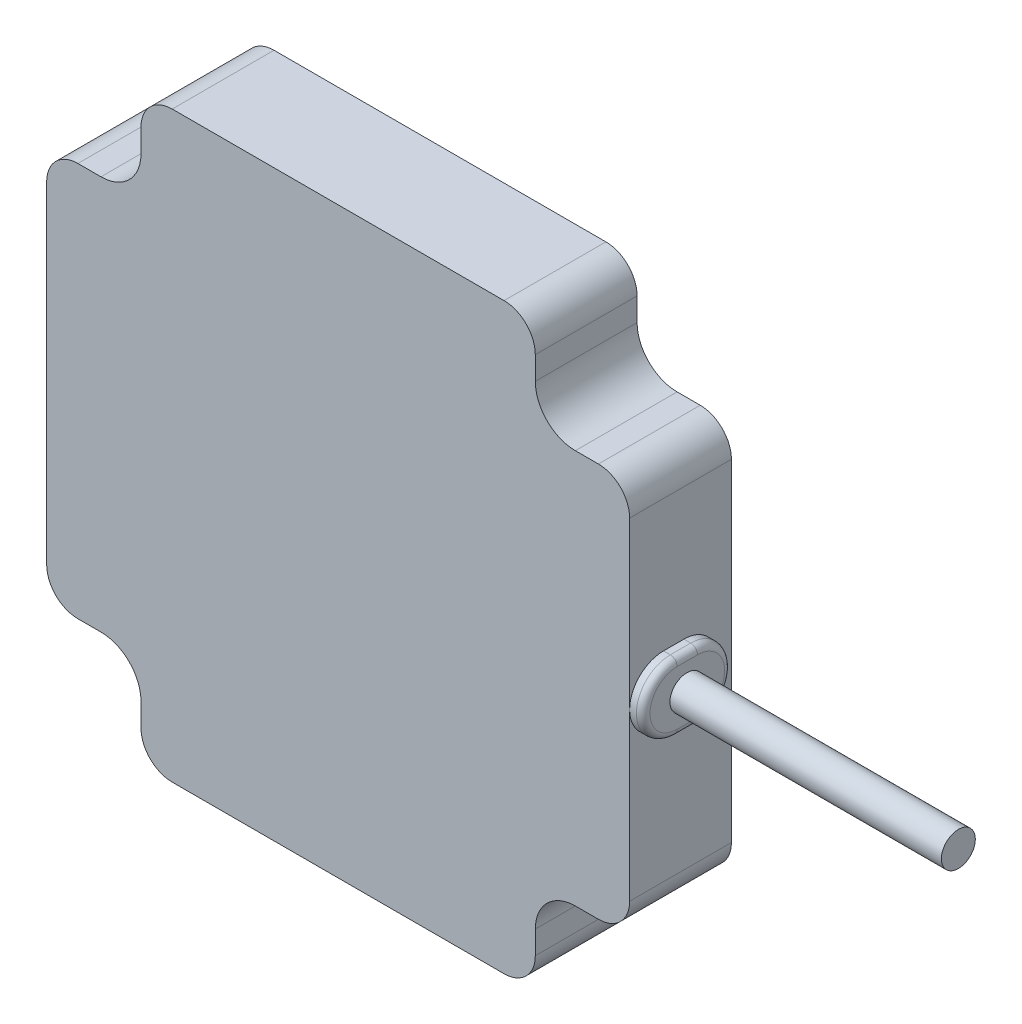
ISO-10303-21;
HEADER;
FILE_DESCRIPTION(('STEP AP214'),'2;1');
FILE_NAME('part.step','',(''),(''),'','','');
FILE_SCHEMA(('AUTOMOTIVE_DESIGN { 1 0 10303 214 1 1 1 1 }'));
ENDSEC;
DATA;
#1=APPLICATION_CONTEXT('core data for automotive mechanical design processes');
#2=APPLICATION_PROTOCOL_DEFINITION('international standard','automotive_design',2000,#1);
#3=PRODUCT_CONTEXT('',#1,'mechanical');
#4=PRODUCT('Part','Part','',(#3));
#5=PRODUCT_RELATED_PRODUCT_CATEGORY('part','',(#4));
#6=PRODUCT_DEFINITION_FORMATION('','',#4);
#7=PRODUCT_DEFINITION_CONTEXT('part definition',#1,'design');
#8=PRODUCT_DEFINITION('design','',#6,#7);
#9=PRODUCT_DEFINITION_SHAPE('','',#8);
#10=(LENGTH_UNIT() NAMED_UNIT(*) SI_UNIT(.MILLI.,.METRE.));
#11=(NAMED_UNIT(*) PLANE_ANGLE_UNIT() SI_UNIT($,.RADIAN.));
#12=(NAMED_UNIT(*) SI_UNIT($,.STERADIAN.) SOLID_ANGLE_UNIT());
#13=UNCERTAINTY_MEASURE_WITH_UNIT(LENGTH_MEASURE(1.E-05),#10,'distance_accuracy_value','');
#14=(GEOMETRIC_REPRESENTATION_CONTEXT(3) GLOBAL_UNCERTAINTY_ASSIGNED_CONTEXT((#13)) GLOBAL_UNIT_ASSIGNED_CONTEXT((#10,
#11,#12)) REPRESENTATION_CONTEXT('',''));
#15=CARTESIAN_POINT('',(0.,0.,0.));
#16=DIRECTION('',(0.,0.,1.));
#17=DIRECTION('',(1.,0.,0.));
#18=AXIS2_PLACEMENT_3D('',#15,#16,#17);
#19=CARTESIAN_POINT('',(-34.9499999999993,-34.9499999999993,0.));
#20=DIRECTION('',(0.,0.,1.));
#21=DIRECTION('',(1.,0.,0.));
#22=AXIS2_PLACEMENT_3D('',#19,#20,#21);
#23=PLANE('',#22);
#24=CARTESIAN_POINT('',(-34.9499999999993,-34.9499999999993,0.));
#25=DIRECTION('',(0.,0.,-1.));
#26=DIRECTION('',(1.,0.,0.));
#27=AXIS2_PLACEMENT_3D('',#24,#25,#26);
#28=CIRCLE('',#27,5.89999999999956);
#29=CARTESIAN_POINT('',(-34.9499999999993,-29.05,0.));
#30=VERTEX_POINT('',#29);
#31=CARTESIAN_POINT('',(-29.05,-34.95,0.));
#32=VERTEX_POINT('',#31);
#33=EDGE_CURVE('P0_E435',#30,#32,#28,.T.);
#34=ORIENTED_EDGE('',*,*,#33,.F.);
#35=DIRECTION('',(1.,0.,0.));
#36=VECTOR('',#35,1.);
#37=CARTESIAN_POINT('',(-34.9499999999993,-29.05,0.));
#38=LINE('',#37,#36);
#39=CARTESIAN_POINT('',(-38.3499999999995,-29.05,0.));
#40=VERTEX_POINT('',#39);
#41=EDGE_CURVE('P0_E26',#40,#30,#38,.T.);
#42=ORIENTED_EDGE('',*,*,#41,.F.);
#43=CARTESIAN_POINT('',(-38.3499999999995,-24.45,0.));
#44=DIRECTION('',(0.,0.,1.));
#45=DIRECTION('',(1.,0.,0.));
#46=AXIS2_PLACEMENT_3D('',#43,#44,#45);
#47=CIRCLE('',#46,4.6);
#48=CARTESIAN_POINT('',(-42.9499999999994,-24.45,0.));
#49=VERTEX_POINT('',#48);
#50=EDGE_CURVE('P0_E334',#49,#40,#47,.T.);
#51=ORIENTED_EDGE('',*,*,#50,.F.);
#52=DIRECTION('',(0.,-1.,0.));
#53=VECTOR('',#52,1.);
#54=CARTESIAN_POINT('',(-42.9499999999994,0.,0.));
#55=LINE('',#54,#53);
#56=CARTESIAN_POINT('',(-42.9499999999995,24.45,0.));
#57=VERTEX_POINT('',#56);
#58=EDGE_CURVE('P0_E414',#57,#49,#55,.T.);
#59=ORIENTED_EDGE('',*,*,#58,.F.);
#60=CARTESIAN_POINT('',(-38.3499999999995,24.45,0.));
#61=DIRECTION('',(0.,0.,1.));
#62=DIRECTION('',(1.,0.,0.));
#63=AXIS2_PLACEMENT_3D('',#60,#61,#62);
#64=CIRCLE('',#63,4.6);
#65=CARTESIAN_POINT('',(-38.3499999999995,29.05,0.));
#66=VERTEX_POINT('',#65);
#67=EDGE_CURVE('P0_E405',#66,#57,#64,.T.);
#68=ORIENTED_EDGE('',*,*,#67,.F.);
#69=DIRECTION('',(-1.,0.,0.));
#70=VECTOR('',#69,1.);
#71=CARTESIAN_POINT('',(-34.9499999999993,29.05,0.));
#72=LINE('',#71,#70);
#73=CARTESIAN_POINT('',(-34.9499999999993,29.0500000000004,0.));
#74=VERTEX_POINT('',#73);
#75=EDGE_CURVE('P0_E328',#74,#66,#72,.T.);
#76=ORIENTED_EDGE('',*,*,#75,.F.);
#77=CARTESIAN_POINT('',(-34.9499999999993,34.95,0.));
#78=DIRECTION('',(0.,0.,-1.));
#79=DIRECTION('',(1.,0.,0.));
#80=AXIS2_PLACEMENT_3D('',#77,#78,#79);
#81=CIRCLE('',#80,5.89999999999977);
#82=CARTESIAN_POINT('',(-29.05,34.95,0.));
#83=VERTEX_POINT('',#82);
#84=EDGE_CURVE('P0_E401',#83,#74,#81,.T.);
#85=ORIENTED_EDGE('',*,*,#84,.F.);
#86=DIRECTION('',(0.,-1.,0.));
#87=VECTOR('',#86,1.);
#88=CARTESIAN_POINT('',(-29.05,34.95,0.));
#89=LINE('',#88,#87);
#90=CARTESIAN_POINT('',(-29.05,38.35,0.));
#91=VERTEX_POINT('',#90);
#92=EDGE_CURVE('P0_E374',#91,#83,#89,.T.);
#93=ORIENTED_EDGE('',*,*,#92,.F.);
#94=CARTESIAN_POINT('',(-24.45,38.35,0.));
#95=DIRECTION('',(0.,0.,1.));
#96=DIRECTION('',(1.,0.,0.));
#97=AXIS2_PLACEMENT_3D('',#94,#95,#96);
#98=CIRCLE('',#97,4.6);
#99=CARTESIAN_POINT('',(-24.4499999999985,42.95,0.));
#100=VERTEX_POINT('',#99);
#101=EDGE_CURVE('P0_E233',#100,#91,#98,.T.);
#102=ORIENTED_EDGE('',*,*,#101,.F.);
#103=DIRECTION('',(-1.,0.,0.));
#104=VECTOR('',#103,1.);
#105=CARTESIAN_POINT('',(1.3739009929736E-12,42.95,0.));
#106=LINE('',#105,#104);
#107=CARTESIAN_POINT('',(24.4500000000012,42.95,0.));
#108=VERTEX_POINT('',#107);
#109=EDGE_CURVE('P0_E226',#108,#100,#106,.T.);
#110=ORIENTED_EDGE('',*,*,#109,.F.);
#111=CARTESIAN_POINT('',(24.4500000000012,38.35,0.));
#112=DIRECTION('',(0.,0.,1.));
#113=DIRECTION('',(1.,0.,0.));
#114=AXIS2_PLACEMENT_3D('',#111,#112,#113);
#115=CIRCLE('',#114,4.59999999999994);
#116=CARTESIAN_POINT('',(29.0500000000011,38.35,0.));
#117=VERTEX_POINT('',#116);
#118=EDGE_CURVE('P0_E230',#117,#108,#115,.T.);
#119=ORIENTED_EDGE('',*,*,#118,.F.);
#120=DIRECTION('',(0.,1.,0.));
#121=VECTOR('',#120,1.);
#122=CARTESIAN_POINT('',(29.0500000000011,34.95,0.));
#123=LINE('',#122,#121);
#124=CARTESIAN_POINT('',(29.0500000000011,34.95,0.));
#125=VERTEX_POINT('',#124);
#126=EDGE_CURVE('P0_E369',#125,#117,#123,.T.);
#127=ORIENTED_EDGE('',*,*,#126,.F.);
#128=CARTESIAN_POINT('',(34.9500000000016,34.9500000000005,0.));
#129=DIRECTION('',(0.,0.,-1.));
#130=DIRECTION('',(1.,0.,0.));
#131=AXIS2_PLACEMENT_3D('',#128,#129,#130);
#132=CIRCLE('',#131,5.90000000000043);
#133=CARTESIAN_POINT('',(34.9500000000016,29.05,0.));
#134=VERTEX_POINT('',#133);
#135=EDGE_CURVE('P0_E301',#134,#125,#132,.T.);
#136=ORIENTED_EDGE('',*,*,#135,.F.);
#137=DIRECTION('',(-1.,0.,0.));
#138=VECTOR('',#137,1.);
#139=CARTESIAN_POINT('',(34.9500000000016,29.05,0.));
#140=LINE('',#139,#138);
#141=CARTESIAN_POINT('',(38.3500000000016,29.05,0.));
#142=VERTEX_POINT('',#141);
#143=EDGE_CURVE('P0_E349',#142,#134,#140,.T.);
#144=ORIENTED_EDGE('',*,*,#143,.F.);
#145=CARTESIAN_POINT('',(38.3500000000014,24.45,0.));
#146=DIRECTION('',(0.,0.,1.));
#147=DIRECTION('',(1.,0.,0.));
#148=AXIS2_PLACEMENT_3D('',#145,#146,#147);
#149=CIRCLE('',#148,4.59999999999994);
#150=CARTESIAN_POINT('',(42.9500000000013,24.4499999999992,0.));
#151=VERTEX_POINT('',#150);
#152=EDGE_CURVE('P0_E323',#151,#142,#149,.T.);
#153=ORIENTED_EDGE('',*,*,#152,.F.);
#154=DIRECTION('',(0.,1.,0.));
#155=VECTOR('',#154,1.);
#156=CARTESIAN_POINT('',(42.9500000000013,-1.11022302462521E-12,0.));
#157=LINE('',#156,#155);
#158=CARTESIAN_POINT('',(42.9500000000013,-24.4500000000008,0.));
#159=VERTEX_POINT('',#158);
#160=EDGE_CURVE('P0_E311',#159,#151,#157,.T.);
#161=ORIENTED_EDGE('',*,*,#160,.F.);
#162=CARTESIAN_POINT('',(38.3500000000013,-24.45,0.));
#163=DIRECTION('',(0.,0.,1.));
#164=DIRECTION('',(1.,0.,0.));
#165=AXIS2_PLACEMENT_3D('',#162,#163,#164);
#166=CIRCLE('',#165,4.6);
#167=CARTESIAN_POINT('',(38.35,-29.05,0.));
#168=VERTEX_POINT('',#167);
#169=EDGE_CURVE('P0_E296',#168,#159,#166,.T.);
#170=ORIENTED_EDGE('',*,*,#169,.F.);
#171=DIRECTION('',(1.,0.,0.));
#172=VECTOR('',#171,1.);
#173=CARTESIAN_POINT('',(34.9500000000013,-29.05,0.));
#174=LINE('',#173,#172);
#175=CARTESIAN_POINT('',(34.9500000000013,-29.05,0.));
#176=VERTEX_POINT('',#175);
#177=EDGE_CURVE('P0_E284',#176,#168,#174,.T.);
#178=ORIENTED_EDGE('',*,*,#177,.F.);
#179=CARTESIAN_POINT('',(34.9499999999993,-34.9499999999996,0.));
#180=DIRECTION('',(0.,0.,-1.));
#181=DIRECTION('',(1.,0.,0.));
#182=AXIS2_PLACEMENT_3D('',#179,#180,#181);
#183=CIRCLE('',#182,5.89999999999966);
#184=CARTESIAN_POINT('',(29.05,-34.9499999999996,0.));
#185=VERTEX_POINT('',#184);
#186=EDGE_CURVE('P0_E275',#185,#176,#183,.T.);
#187=ORIENTED_EDGE('',*,*,#186,.F.);
#188=DIRECTION('',(0.,1.,0.));
#189=VECTOR('',#188,1.);
#190=CARTESIAN_POINT('',(29.05,-34.9499999999996,0.));
#191=LINE('',#190,#189);
#192=CARTESIAN_POINT('',(29.05,-38.35,0.));
#193=VERTEX_POINT('',#192);
#194=EDGE_CURVE('P0_E266',#193,#185,#191,.T.);
#195=ORIENTED_EDGE('',*,*,#194,.F.);
#196=CARTESIAN_POINT('',(24.45,-38.35,0.));
#197=DIRECTION('',(0.,0.,1.));
#198=DIRECTION('',(1.,0.,0.));
#199=AXIS2_PLACEMENT_3D('',#196,#197,#198);
#200=CIRCLE('',#199,4.6);
#201=CARTESIAN_POINT('',(24.45,-42.95,0.));
#202=VERTEX_POINT('',#201);
#203=EDGE_CURVE('P0_E472',#202,#193,#200,.T.);
#204=ORIENTED_EDGE('',*,*,#203,.F.);
#205=DIRECTION('',(1.,0.,0.));
#206=VECTOR('',#205,1.);
#207=CARTESIAN_POINT('',(0.,-42.95,0.));
#208=LINE('',#207,#206);
#209=CARTESIAN_POINT('',(-24.45,-42.95,0.));
#210=VERTEX_POINT('',#209);
#211=EDGE_CURVE('P0_E488',#210,#202,#208,.T.);
#212=ORIENTED_EDGE('',*,*,#211,.F.);
#213=CARTESIAN_POINT('',(-24.45,-38.35,0.));
#214=DIRECTION('',(0.,0.,1.));
#215=DIRECTION('',(1.,0.,0.));
#216=AXIS2_PLACEMENT_3D('',#213,#214,#215);
#217=CIRCLE('',#216,4.59999999999994);
#218=CARTESIAN_POINT('',(-29.05,-38.35,0.));
#219=VERTEX_POINT('',#218);
#220=EDGE_CURVE('P0_E480',#219,#210,#217,.T.);
#221=ORIENTED_EDGE('',*,*,#220,.F.);
#222=DIRECTION('',(0.,-1.,0.));
#223=VECTOR('',#222,1.);
#224=CARTESIAN_POINT('',(-29.05,-34.95,0.));
#225=LINE('',#224,#223);
#226=EDGE_CURVE('P0_E439',#32,#219,#225,.T.);
#227=ORIENTED_EDGE('',*,*,#226,.F.);
#228=EDGE_LOOP('',(#34,#42,#51,#59,#68,#76,#85,#93,#102,#110,#119,#127,#136,#144,#153,#161,#170,
#178,#187,#195,#204,#212,#221,#227));
#229=FACE_BOUND('',#228,.T.);
#230=ADVANCED_FACE('P0_F17',(#229),#23,.F.);
#231=CARTESIAN_POINT('',(-34.9499999999993,-34.9499999999993,15.));
#232=DIRECTION('',(0.,0.,1.));
#233=DIRECTION('',(1.,0.,0.));
#234=AXIS2_PLACEMENT_3D('',#231,#232,#233);
#235=PLANE('',#234);
#236=CARTESIAN_POINT('',(-34.9499999999993,-34.9499999999993,15.));
#237=DIRECTION('',(0.,0.,-1.));
#238=DIRECTION('',(1.,0.,0.));
#239=AXIS2_PLACEMENT_3D('',#236,#237,#238);
#240=CIRCLE('',#239,5.89999999999956);
#241=CARTESIAN_POINT('',(-34.9499999999993,-29.05,15.));
#242=VERTEX_POINT('',#241);
#243=CARTESIAN_POINT('',(-29.05,-34.95,15.));
#244=VERTEX_POINT('',#243);
#245=EDGE_CURVE('P0_E437',#242,#244,#240,.T.);
#246=ORIENTED_EDGE('',*,*,#245,.T.);
#247=DIRECTION('',(0.,-1.,0.));
#248=VECTOR('',#247,1.);
#249=CARTESIAN_POINT('',(-29.05,-34.95,15.));
#250=LINE('',#249,#248);
#251=CARTESIAN_POINT('',(-29.05,-38.35,15.));
#252=VERTEX_POINT('',#251);
#253=EDGE_CURVE('P0_E471',#244,#252,#250,.T.);
#254=ORIENTED_EDGE('',*,*,#253,.T.);
#255=CARTESIAN_POINT('',(-24.45,-38.35,15.));
#256=DIRECTION('',(0.,0.,1.));
#257=DIRECTION('',(1.,0.,0.));
#258=AXIS2_PLACEMENT_3D('',#255,#256,#257);
#259=CIRCLE('',#258,4.59999999999994);
#260=CARTESIAN_POINT('',(-24.45,-42.95,15.));
#261=VERTEX_POINT('',#260);
#262=EDGE_CURVE('P0_E454',#252,#261,#259,.T.);
#263=ORIENTED_EDGE('',*,*,#262,.T.);
#264=DIRECTION('',(1.,0.,0.));
#265=VECTOR('',#264,1.);
#266=CARTESIAN_POINT('',(0.,-42.95,15.));
#267=LINE('',#266,#265);
#268=CARTESIAN_POINT('',(24.45,-42.95,15.));
#269=VERTEX_POINT('',#268);
#270=EDGE_CURVE('P0_E476',#261,#269,#267,.T.);
#271=ORIENTED_EDGE('',*,*,#270,.T.);
#272=CARTESIAN_POINT('',(24.45,-38.35,15.));
#273=DIRECTION('',(0.,0.,1.));
#274=DIRECTION('',(1.,0.,0.));
#275=AXIS2_PLACEMENT_3D('',#272,#273,#274);
#276=CIRCLE('',#275,4.6);
#277=CARTESIAN_POINT('',(29.05,-38.35,15.));
#278=VERTEX_POINT('',#277);
#279=EDGE_CURVE('P0_E456',#269,#278,#276,.T.);
#280=ORIENTED_EDGE('',*,*,#279,.T.);
#281=DIRECTION('',(0.,1.,0.));
#282=VECTOR('',#281,1.);
#283=CARTESIAN_POINT('',(29.05,-34.9499999999996,15.));
#284=LINE('',#283,#282);
#285=CARTESIAN_POINT('',(29.05,-34.9499999999996,15.));
#286=VERTEX_POINT('',#285);
#287=EDGE_CURVE('P0_E271',#278,#286,#284,.T.);
#288=ORIENTED_EDGE('',*,*,#287,.T.);
#289=CARTESIAN_POINT('',(34.9499999999993,-34.9499999999996,15.));
#290=DIRECTION('',(0.,0.,-1.));
#291=DIRECTION('',(1.,0.,0.));
#292=AXIS2_PLACEMENT_3D('',#289,#290,#291);
#293=CIRCLE('',#292,5.89999999999966);
#294=CARTESIAN_POINT('',(34.9500000000013,-29.05,15.));
#295=VERTEX_POINT('',#294);
#296=EDGE_CURVE('P0_E280',#286,#295,#293,.T.);
#297=ORIENTED_EDGE('',*,*,#296,.T.);
#298=DIRECTION('',(1.,0.,0.));
#299=VECTOR('',#298,1.);
#300=CARTESIAN_POINT('',(34.9500000000013,-29.05,15.));
#301=LINE('',#300,#299);
#302=CARTESIAN_POINT('',(38.35,-29.05,15.));
#303=VERTEX_POINT('',#302);
#304=EDGE_CURVE('P0_E292',#295,#303,#301,.T.);
#305=ORIENTED_EDGE('',*,*,#304,.T.);
#306=CARTESIAN_POINT('',(38.3500000000013,-24.45,15.));
#307=DIRECTION('',(0.,0.,1.));
#308=DIRECTION('',(1.,0.,0.));
#309=AXIS2_PLACEMENT_3D('',#306,#307,#308);
#310=CIRCLE('',#309,4.6);
#311=CARTESIAN_POINT('',(42.9500000000013,-24.4500000000008,15.));
#312=VERTEX_POINT('',#311);
#313=EDGE_CURVE('P0_E310',#303,#312,#310,.T.);
#314=ORIENTED_EDGE('',*,*,#313,.T.);
#315=DIRECTION('',(0.,1.,0.));
#316=VECTOR('',#315,1.);
#317=CARTESIAN_POINT('',(42.9500000000013,-1.11022302462521E-12,15.));
#318=LINE('',#317,#316);
#319=CARTESIAN_POINT('',(42.9500000000013,24.4499999999992,15.));
#320=VERTEX_POINT('',#319);
#321=EDGE_CURVE('P0_E319',#312,#320,#318,.T.);
#322=ORIENTED_EDGE('',*,*,#321,.T.);
#323=CARTESIAN_POINT('',(38.3500000000014,24.45,15.));
#324=DIRECTION('',(0.,0.,1.));
#325=DIRECTION('',(1.,0.,0.));
#326=AXIS2_PLACEMENT_3D('',#323,#324,#325);
#327=CIRCLE('',#326,4.59999999999994);
#328=CARTESIAN_POINT('',(38.3500000000016,29.05,15.));
#329=VERTEX_POINT('',#328);
#330=EDGE_CURVE('P0_E343',#320,#329,#327,.T.);
#331=ORIENTED_EDGE('',*,*,#330,.T.);
#332=DIRECTION('',(-1.,0.,0.));
#333=VECTOR('',#332,1.);
#334=CARTESIAN_POINT('',(34.9500000000016,29.05,15.));
#335=LINE('',#334,#333);
#336=CARTESIAN_POINT('',(34.9500000000016,29.05,15.));
#337=VERTEX_POINT('',#336);
#338=EDGE_CURVE('P0_E297',#329,#337,#335,.T.);
#339=ORIENTED_EDGE('',*,*,#338,.T.);
#340=CARTESIAN_POINT('',(34.9500000000016,34.9500000000005,15.));
#341=DIRECTION('',(0.,0.,-1.));
#342=DIRECTION('',(1.,0.,0.));
#343=AXIS2_PLACEMENT_3D('',#340,#341,#342);
#344=CIRCLE('',#343,5.90000000000043);
#345=CARTESIAN_POINT('',(29.0500000000011,34.95,15.));
#346=VERTEX_POINT('',#345);
#347=EDGE_CURVE('P0_E360',#337,#346,#344,.T.);
#348=ORIENTED_EDGE('',*,*,#347,.T.);
#349=DIRECTION('',(0.,1.,0.));
#350=VECTOR('',#349,1.);
#351=CARTESIAN_POINT('',(29.0500000000011,34.95,15.));
#352=LINE('',#351,#350);
#353=CARTESIAN_POINT('',(29.0500000000011,38.35,15.));
#354=VERTEX_POINT('',#353);
#355=EDGE_CURVE('P0_E255',#346,#354,#352,.T.);
#356=ORIENTED_EDGE('',*,*,#355,.T.);
#357=CARTESIAN_POINT('',(24.4500000000012,38.35,15.));
#358=DIRECTION('',(0.,0.,1.));
#359=DIRECTION('',(1.,0.,0.));
#360=AXIS2_PLACEMENT_3D('',#357,#358,#359);
#361=CIRCLE('',#360,4.59999999999994);
#362=CARTESIAN_POINT('',(24.4500000000012,42.95,15.));
#363=VERTEX_POINT('',#362);
#364=EDGE_CURVE('P0_E239',#354,#363,#361,.T.);
#365=ORIENTED_EDGE('',*,*,#364,.T.);
#366=DIRECTION('',(-1.,0.,0.));
#367=VECTOR('',#366,1.);
#368=CARTESIAN_POINT('',(1.3739009929736E-12,42.95,15.));
#369=LINE('',#368,#367);
#370=CARTESIAN_POINT('',(-24.4499999999985,42.95,15.));
#371=VERTEX_POINT('',#370);
#372=EDGE_CURVE('P0_E245',#363,#371,#369,.T.);
#373=ORIENTED_EDGE('',*,*,#372,.T.);
#374=CARTESIAN_POINT('',(-24.45,38.35,15.));
#375=DIRECTION('',(0.,0.,1.));
#376=DIRECTION('',(1.,0.,0.));
#377=AXIS2_PLACEMENT_3D('',#374,#375,#376);
#378=CIRCLE('',#377,4.6);
#379=CARTESIAN_POINT('',(-29.05,38.35,15.));
#380=VERTEX_POINT('',#379);
#381=EDGE_CURVE('P0_E370',#371,#380,#378,.T.);
#382=ORIENTED_EDGE('',*,*,#381,.T.);
#383=DIRECTION('',(0.,-1.,0.));
#384=VECTOR('',#383,1.);
#385=CARTESIAN_POINT('',(-29.05,34.95,15.));
#386=LINE('',#385,#384);
#387=CARTESIAN_POINT('',(-29.05,34.95,15.));
#388=VERTEX_POINT('',#387);
#389=EDGE_CURVE('P0_E397',#380,#388,#386,.T.);
#390=ORIENTED_EDGE('',*,*,#389,.T.);
#391=CARTESIAN_POINT('',(-34.9499999999993,34.95,15.));
#392=DIRECTION('',(0.,0.,-1.));
#393=DIRECTION('',(1.,0.,0.));
#394=AXIS2_PLACEMENT_3D('',#391,#392,#393);
#395=CIRCLE('',#394,5.89999999999977);
#396=CARTESIAN_POINT('',(-34.9499999999993,29.0500000000004,15.));
#397=VERTEX_POINT('',#396);
#398=EDGE_CURVE('P0_E324',#388,#397,#395,.T.);
#399=ORIENTED_EDGE('',*,*,#398,.T.);
#400=DIRECTION('',(-1.,0.,0.));
#401=VECTOR('',#400,1.);
#402=CARTESIAN_POINT('',(-34.9499999999993,29.05,15.));
#403=LINE('',#402,#401);
#404=CARTESIAN_POINT('',(-38.3499999999995,29.05,15.));
#405=VERTEX_POINT('',#404);
#406=EDGE_CURVE('P0_E365',#397,#405,#403,.T.);
#407=ORIENTED_EDGE('',*,*,#406,.T.);
#408=CARTESIAN_POINT('',(-38.3499999999995,24.45,15.));
#409=DIRECTION('',(0.,0.,1.));
#410=DIRECTION('',(1.,0.,0.));
#411=AXIS2_PLACEMENT_3D('',#408,#409,#410);
#412=CIRCLE('',#411,4.6);
#413=CARTESIAN_POINT('',(-42.9499999999995,24.45,15.));
#414=VERTEX_POINT('',#413);
#415=EDGE_CURVE('P0_E410',#405,#414,#412,.T.);
#416=ORIENTED_EDGE('',*,*,#415,.T.);
#417=DIRECTION('',(0.,-1.,0.));
#418=VECTOR('',#417,1.);
#419=CARTESIAN_POINT('',(-42.9499999999994,0.,15.));
#420=LINE('',#419,#418);
#421=CARTESIAN_POINT('',(-42.9499999999994,-24.45,15.));
#422=VERTEX_POINT('',#421);
#423=EDGE_CURVE('P0_E339',#414,#422,#420,.T.);
#424=ORIENTED_EDGE('',*,*,#423,.T.);
#425=CARTESIAN_POINT('',(-38.3499999999995,-24.45,15.));
#426=DIRECTION('',(0.,0.,1.));
#427=DIRECTION('',(1.,0.,0.));
#428=AXIS2_PLACEMENT_3D('',#425,#426,#427);
#429=CIRCLE('',#428,4.6);
#430=CARTESIAN_POINT('',(-38.3499999999995,-29.05,15.));
#431=VERTEX_POINT('',#430);
#432=EDGE_CURVE('P0_E380',#422,#431,#429,.T.);
#433=ORIENTED_EDGE('',*,*,#432,.T.);
#434=DIRECTION('',(1.,0.,0.));
#435=VECTOR('',#434,1.);
#436=CARTESIAN_POINT('',(-34.9499999999993,-29.05,15.));
#437=LINE('',#436,#435);
#438=EDGE_CURVE('P0_E11',#431,#242,#437,.T.);
#439=ORIENTED_EDGE('',*,*,#438,.T.);
#440=EDGE_LOOP('',(#246,#254,#263,#271,#280,#288,#297,#305,#314,#322,#331,#339,#348,#356,#365,
#373,#382,#390,#399,#407,#416,#424,#433,#439));
#441=FACE_BOUND('',#440,.T.);
#442=ADVANCED_FACE('P0_F531',(#441),#235,.T.);
#443=CARTESIAN_POINT('',(-34.9499999999993,-29.05,15.));
#444=DIRECTION('',(0.,1.,0.));
#445=DIRECTION('',(1.,0.,0.));
#446=AXIS2_PLACEMENT_3D('',#443,#444,#445);
#447=PLANE('',#446);
#448=ORIENTED_EDGE('',*,*,#41,.T.);
#449=DIRECTION('',(0.,0.,-1.));
#450=VECTOR('',#449,1.);
#451=CARTESIAN_POINT('',(-34.9499999999993,-29.05,15.));
#452=LINE('',#451,#450);
#453=EDGE_CURVE('P0_E428',#242,#30,#452,.T.);
#454=ORIENTED_EDGE('',*,*,#453,.F.);
#455=ORIENTED_EDGE('',*,*,#438,.F.);
#456=DIRECTION('',(0.,0.,-1.));
#457=VECTOR('',#456,1.);
#458=CARTESIAN_POINT('',(-38.3499999999995,-29.05,15.));
#459=LINE('',#458,#457);
#460=EDGE_CURVE('P0_E338',#431,#40,#459,.T.);
#461=ORIENTED_EDGE('',*,*,#460,.T.);
#462=EDGE_LOOP('',(#448,#454,#455,#461));
#463=FACE_BOUND('',#462,.T.);
#464=ADVANCED_FACE('P0_F427',(#463),#447,.F.);
#465=CARTESIAN_POINT('',(-38.3499999999995,-24.45,15.));
#466=DIRECTION('',(0.,0.,-1.));
#467=DIRECTION('',(-1.,0.,0.));
#468=AXIS2_PLACEMENT_3D('',#465,#466,#467);
#469=CYLINDRICAL_SURFACE('',#468,4.6);
#470=ORIENTED_EDGE('',*,*,#50,.T.);
#471=ORIENTED_EDGE('',*,*,#460,.F.);
#472=ORIENTED_EDGE('',*,*,#432,.F.);
#473=DIRECTION('',(0.,0.,-1.));
#474=VECTOR('',#473,1.);
#475=CARTESIAN_POINT('',(-42.9499999999994,-24.45,15.));
#476=LINE('',#475,#474);
#477=EDGE_CURVE('P0_E417',#422,#49,#476,.T.);
#478=ORIENTED_EDGE('',*,*,#477,.T.);
#479=EDGE_LOOP('',(#470,#471,#472,#478));
#480=FACE_BOUND('',#479,.T.);
#481=ADVANCED_FACE('P0_F873',(#480),#469,.T.);
#482=CARTESIAN_POINT('',(-42.9499999999994,0.,15.));
#483=DIRECTION('',(1.,0.,0.));
#484=DIRECTION('',(0.,1.,0.));
#485=AXIS2_PLACEMENT_3D('',#482,#483,#484);
#486=PLANE('',#485);
#487=ORIENTED_EDGE('',*,*,#58,.T.);
#488=ORIENTED_EDGE('',*,*,#477,.F.);
#489=ORIENTED_EDGE('',*,*,#423,.F.);
#490=DIRECTION('',(0.,0.,-1.));
#491=VECTOR('',#490,1.);
#492=CARTESIAN_POINT('',(-42.9499999999995,24.45,15.));
#493=LINE('',#492,#491);
#494=EDGE_CURVE('P0_E409',#414,#57,#493,.T.);
#495=ORIENTED_EDGE('',*,*,#494,.T.);
#496=EDGE_LOOP('',(#487,#488,#489,#495));
#497=FACE_BOUND('',#496,.T.);
#498=ADVANCED_FACE('P0_F865',(#497),#486,.F.);
#499=CARTESIAN_POINT('',(-38.3499999999995,24.45,15.));
#500=DIRECTION('',(0.,0.,-1.));
#501=DIRECTION('',(-1.,0.,0.));
#502=AXIS2_PLACEMENT_3D('',#499,#500,#501);
#503=CYLINDRICAL_SURFACE('',#502,4.6);
#504=ORIENTED_EDGE('',*,*,#67,.T.);
#505=ORIENTED_EDGE('',*,*,#494,.F.);
#506=ORIENTED_EDGE('',*,*,#415,.F.);
#507=DIRECTION('',(0.,0.,-1.));
#508=VECTOR('',#507,1.);
#509=CARTESIAN_POINT('',(-38.3499999999995,29.05,15.));
#510=LINE('',#509,#508);
#511=EDGE_CURVE('P0_E361',#405,#66,#510,.T.);
#512=ORIENTED_EDGE('',*,*,#511,.T.);
#513=EDGE_LOOP('',(#504,#505,#506,#512));
#514=FACE_BOUND('',#513,.T.);
#515=ADVANCED_FACE('P0_F529',(#514),#503,.T.);
#516=CARTESIAN_POINT('',(-34.9499999999993,29.05,15.));
#517=DIRECTION('',(0.,-1.,0.));
#518=DIRECTION('',(0.,0.,-1.));
#519=AXIS2_PLACEMENT_3D('',#516,#517,#518);
#520=PLANE('',#519);
#521=ORIENTED_EDGE('',*,*,#75,.T.);
#522=ORIENTED_EDGE('',*,*,#511,.F.);
#523=ORIENTED_EDGE('',*,*,#406,.F.);
#524=DIRECTION('',(0.,0.,-1.));
#525=VECTOR('',#524,1.);
#526=CARTESIAN_POINT('',(-34.9499999999993,29.0500000000004,15.));
#527=LINE('',#526,#525);
#528=EDGE_CURVE('P0_E329',#397,#74,#527,.T.);
#529=ORIENTED_EDGE('',*,*,#528,.T.);
#530=EDGE_LOOP('',(#521,#522,#523,#529));
#531=FACE_BOUND('',#530,.T.);
#532=ADVANCED_FACE('P0_F524',(#531),#520,.F.);
#533=CARTESIAN_POINT('',(-34.9499999999993,34.95,15.));
#534=DIRECTION('',(0.,0.,-1.));
#535=DIRECTION('',(-1.,0.,0.));
#536=AXIS2_PLACEMENT_3D('',#533,#534,#535);
#537=CYLINDRICAL_SURFACE('',#536,5.89999999999977);
#538=ORIENTED_EDGE('',*,*,#84,.T.);
#539=ORIENTED_EDGE('',*,*,#528,.F.);
#540=ORIENTED_EDGE('',*,*,#398,.F.);
#541=DIRECTION('',(0.,0.,-1.));
#542=VECTOR('',#541,1.);
#543=CARTESIAN_POINT('',(-29.05,34.95,15.));
#544=LINE('',#543,#542);
#545=EDGE_CURVE('P0_E393',#388,#83,#544,.T.);
#546=ORIENTED_EDGE('',*,*,#545,.T.);
#547=EDGE_LOOP('',(#538,#539,#540,#546));
#548=FACE_BOUND('',#547,.T.);
#549=ADVANCED_FACE('P0_F534',(#548),#537,.F.);
#550=CARTESIAN_POINT('',(-29.05,34.95,15.));
#551=DIRECTION('',(1.,0.,0.));
#552=DIRECTION('',(0.,1.,0.));
#553=AXIS2_PLACEMENT_3D('',#550,#551,#552);
#554=PLANE('',#553);
#555=ORIENTED_EDGE('',*,*,#92,.T.);
#556=ORIENTED_EDGE('',*,*,#545,.F.);
#557=ORIENTED_EDGE('',*,*,#389,.F.);
#558=DIRECTION('',(0.,0.,-1.));
#559=VECTOR('',#558,1.);
#560=CARTESIAN_POINT('',(-29.05,38.35,15.));
#561=LINE('',#560,#559);
#562=EDGE_CURVE('P0_E375',#380,#91,#561,.T.);
#563=ORIENTED_EDGE('',*,*,#562,.T.);
#564=EDGE_LOOP('',(#555,#556,#557,#563));
#565=FACE_BOUND('',#564,.T.);
#566=ADVANCED_FACE('P0_F536',(#565),#554,.F.);
#567=CARTESIAN_POINT('',(-24.45,38.35,15.));
#568=DIRECTION('',(0.,0.,-1.));
#569=DIRECTION('',(-1.,0.,0.));
#570=AXIS2_PLACEMENT_3D('',#567,#568,#569);
#571=CYLINDRICAL_SURFACE('',#570,4.6);
#572=ORIENTED_EDGE('',*,*,#101,.T.);
#573=ORIENTED_EDGE('',*,*,#562,.F.);
#574=ORIENTED_EDGE('',*,*,#381,.F.);
#575=DIRECTION('',(0.,0.,-1.));
#576=VECTOR('',#575,1.);
#577=CARTESIAN_POINT('',(-24.4499999999985,42.95,15.));
#578=LINE('',#577,#576);
#579=EDGE_CURVE('P0_E238',#371,#100,#578,.T.);
#580=ORIENTED_EDGE('',*,*,#579,.T.);
#581=EDGE_LOOP('',(#572,#573,#574,#580));
#582=FACE_BOUND('',#581,.T.);
#583=ADVANCED_FACE('P0_F539',(#582),#571,.T.);
#584=CARTESIAN_POINT('',(1.3739009929736E-12,42.95,15.));
#585=DIRECTION('',(0.,-1.,0.));
#586=DIRECTION('',(0.,0.,-1.));
#587=AXIS2_PLACEMENT_3D('',#584,#585,#586);
#588=PLANE('',#587);
#589=ORIENTED_EDGE('',*,*,#109,.T.);
#590=ORIENTED_EDGE('',*,*,#579,.F.);
#591=ORIENTED_EDGE('',*,*,#372,.F.);
#592=DIRECTION('',(0.,0.,-1.));
#593=VECTOR('',#592,1.);
#594=CARTESIAN_POINT('',(24.4500000000012,42.95,15.));
#595=LINE('',#594,#593);
#596=EDGE_CURVE('P0_E242',#363,#108,#595,.T.);
#597=ORIENTED_EDGE('',*,*,#596,.T.);
#598=EDGE_LOOP('',(#589,#590,#591,#597));
#599=FACE_BOUND('',#598,.T.);
#600=ADVANCED_FACE('P0_F243',(#599),#588,.F.);
#601=CARTESIAN_POINT('',(24.4500000000012,38.35,15.));
#602=DIRECTION('',(0.,0.,-1.));
#603=DIRECTION('',(-1.,0.,0.));
#604=AXIS2_PLACEMENT_3D('',#601,#602,#603);
#605=CYLINDRICAL_SURFACE('',#604,4.59999999999994);
#606=ORIENTED_EDGE('',*,*,#118,.T.);
#607=ORIENTED_EDGE('',*,*,#596,.F.);
#608=ORIENTED_EDGE('',*,*,#364,.F.);
#609=DIRECTION('',(0.,0.,-1.));
#610=VECTOR('',#609,1.);
#611=CARTESIAN_POINT('',(29.0500000000011,38.35,15.));
#612=LINE('',#611,#610);
#613=EDGE_CURVE('P0_E252',#354,#117,#612,.T.);
#614=ORIENTED_EDGE('',*,*,#613,.T.);
#615=EDGE_LOOP('',(#606,#607,#608,#614));
#616=FACE_BOUND('',#615,.T.);
#617=ADVANCED_FACE('P0_F250',(#616),#605,.T.);
#618=CARTESIAN_POINT('',(29.0500000000011,34.95,15.));
#619=DIRECTION('',(-1.,0.,0.));
#620=DIRECTION('',(0.,0.,1.));
#621=AXIS2_PLACEMENT_3D('',#618,#619,#620);
#622=PLANE('',#621);
#623=ORIENTED_EDGE('',*,*,#126,.T.);
#624=ORIENTED_EDGE('',*,*,#613,.F.);
#625=ORIENTED_EDGE('',*,*,#355,.F.);
#626=DIRECTION('',(0.,0.,-1.));
#627=VECTOR('',#626,1.);
#628=CARTESIAN_POINT('',(29.0500000000011,34.95,15.));
#629=LINE('',#628,#627);
#630=EDGE_CURVE('P0_E355',#346,#125,#629,.T.);
#631=ORIENTED_EDGE('',*,*,#630,.T.);
#632=EDGE_LOOP('',(#623,#624,#625,#631));
#633=FACE_BOUND('',#632,.T.);
#634=ADVANCED_FACE('P0_F542',(#633),#622,.F.);
#635=CARTESIAN_POINT('',(34.9500000000016,34.9500000000005,15.));
#636=DIRECTION('',(0.,0.,-1.));
#637=DIRECTION('',(-1.,0.,0.));
#638=AXIS2_PLACEMENT_3D('',#635,#636,#637);
#639=CYLINDRICAL_SURFACE('',#638,5.90000000000043);
#640=ORIENTED_EDGE('',*,*,#135,.T.);
#641=ORIENTED_EDGE('',*,*,#630,.F.);
#642=ORIENTED_EDGE('',*,*,#347,.F.);
#643=DIRECTION('',(0.,0.,-1.));
#644=VECTOR('',#643,1.);
#645=CARTESIAN_POINT('',(34.9500000000016,29.05,15.));
#646=LINE('',#645,#644);
#647=EDGE_CURVE('P0_E302',#337,#134,#646,.T.);
#648=ORIENTED_EDGE('',*,*,#647,.T.);
#649=EDGE_LOOP('',(#640,#641,#642,#648));
#650=FACE_BOUND('',#649,.T.);
#651=ADVANCED_FACE('P0_F545',(#650),#639,.F.);
#652=CARTESIAN_POINT('',(34.9500000000016,29.05,15.));
#653=DIRECTION('',(0.,-1.,0.));
#654=DIRECTION('',(0.,0.,-1.));
#655=AXIS2_PLACEMENT_3D('',#652,#653,#654);
#656=PLANE('',#655);
#657=ORIENTED_EDGE('',*,*,#143,.T.);
#658=ORIENTED_EDGE('',*,*,#647,.F.);
#659=ORIENTED_EDGE('',*,*,#338,.F.);
#660=DIRECTION('',(0.,0.,-1.));
#661=VECTOR('',#660,1.);
#662=CARTESIAN_POINT('',(38.3500000000016,29.05,15.));
#663=LINE('',#662,#661);
#664=EDGE_CURVE('P0_E333',#329,#142,#663,.T.);
#665=ORIENTED_EDGE('',*,*,#664,.T.);
#666=EDGE_LOOP('',(#657,#658,#659,#665));
#667=FACE_BOUND('',#666,.T.);
#668=ADVANCED_FACE('P0_F547',(#667),#656,.F.);
#669=CARTESIAN_POINT('',(38.3500000000014,24.45,15.));
#670=DIRECTION('',(0.,0.,-1.));
#671=DIRECTION('',(-1.,0.,0.));
#672=AXIS2_PLACEMENT_3D('',#669,#670,#671);
#673=CYLINDRICAL_SURFACE('',#672,4.59999999999994);
#674=ORIENTED_EDGE('',*,*,#152,.T.);
#675=ORIENTED_EDGE('',*,*,#664,.F.);
#676=ORIENTED_EDGE('',*,*,#330,.F.);
#677=DIRECTION('',(0.,0.,-1.));
#678=VECTOR('',#677,1.);
#679=CARTESIAN_POINT('',(42.9500000000013,24.4499999999992,15.));
#680=LINE('',#679,#678);
#681=EDGE_CURVE('P0_E315',#320,#151,#680,.T.);
#682=ORIENTED_EDGE('',*,*,#681,.T.);
#683=EDGE_LOOP('',(#674,#675,#676,#682));
#684=FACE_BOUND('',#683,.T.);
#685=ADVANCED_FACE('P0_F550',(#684),#673,.T.);
#686=CARTESIAN_POINT('',(42.9500000000013,-1.11022302462521E-12,15.));
#687=DIRECTION('',(-1.,0.,0.));
#688=DIRECTION('',(0.,0.,1.));
#689=AXIS2_PLACEMENT_3D('',#686,#687,#688);
#690=PLANE('',#689);
#691=ORIENTED_EDGE('',*,*,#160,.T.);
#692=ORIENTED_EDGE('',*,*,#681,.F.);
#693=ORIENTED_EDGE('',*,*,#321,.F.);
#694=DIRECTION('',(0.,0.,-1.));
#695=VECTOR('',#694,1.);
#696=CARTESIAN_POINT('',(42.9500000000013,-24.4500000000008,15.));
#697=LINE('',#696,#695);
#698=EDGE_CURVE('P0_E306',#312,#159,#697,.T.);
#699=ORIENTED_EDGE('',*,*,#698,.T.);
#700=EDGE_LOOP('',(#691,#692,#693,#699));
#701=FACE_BOUND('',#700,.T.);
#702=ADVANCED_FACE('P0_F554',(#701),#690,.F.);
#703=CARTESIAN_POINT('',(38.3500000000013,-24.45,15.));
#704=DIRECTION('',(0.,0.,-1.));
#705=DIRECTION('',(-1.,0.,0.));
#706=AXIS2_PLACEMENT_3D('',#703,#704,#705);
#707=CYLINDRICAL_SURFACE('',#706,4.6);
#708=ORIENTED_EDGE('',*,*,#169,.T.);
#709=ORIENTED_EDGE('',*,*,#698,.F.);
#710=ORIENTED_EDGE('',*,*,#313,.F.);
#711=DIRECTION('',(0.,0.,-1.));
#712=VECTOR('',#711,1.);
#713=CARTESIAN_POINT('',(38.35,-29.05,15.));
#714=LINE('',#713,#712);
#715=EDGE_CURVE('P0_E288',#303,#168,#714,.T.);
#716=ORIENTED_EDGE('',*,*,#715,.T.);
#717=EDGE_LOOP('',(#708,#709,#710,#716));
#718=FACE_BOUND('',#717,.T.);
#719=ADVANCED_FACE('P0_F556',(#718),#707,.T.);
#720=CARTESIAN_POINT('',(34.9500000000013,-29.05,15.));
#721=DIRECTION('',(0.,1.,0.));
#722=DIRECTION('',(1.,0.,0.));
#723=AXIS2_PLACEMENT_3D('',#720,#721,#722);
#724=PLANE('',#723);
#725=ORIENTED_EDGE('',*,*,#177,.T.);
#726=ORIENTED_EDGE('',*,*,#715,.F.);
#727=ORIENTED_EDGE('',*,*,#304,.F.);
#728=DIRECTION('',(0.,0.,-1.));
#729=VECTOR('',#728,1.);
#730=CARTESIAN_POINT('',(34.9500000000013,-29.05,15.));
#731=LINE('',#730,#729);
#732=EDGE_CURVE('P0_E276',#295,#176,#731,.T.);
#733=ORIENTED_EDGE('',*,*,#732,.T.);
#734=EDGE_LOOP('',(#725,#726,#727,#733));
#735=FACE_BOUND('',#734,.T.);
#736=ADVANCED_FACE('P0_F559',(#735),#724,.F.);
#737=CARTESIAN_POINT('',(34.9499999999993,-34.9499999999996,15.));
#738=DIRECTION('',(0.,0.,-1.));
#739=DIRECTION('',(-1.,0.,0.));
#740=AXIS2_PLACEMENT_3D('',#737,#738,#739);
#741=CYLINDRICAL_SURFACE('',#740,5.89999999999966);
#742=ORIENTED_EDGE('',*,*,#186,.T.);
#743=ORIENTED_EDGE('',*,*,#732,.F.);
#744=ORIENTED_EDGE('',*,*,#296,.F.);
#745=DIRECTION('',(0.,0.,-1.));
#746=VECTOR('',#745,1.);
#747=CARTESIAN_POINT('',(29.05,-34.9499999999996,15.));
#748=LINE('',#747,#746);
#749=EDGE_CURVE('P0_E268',#286,#185,#748,.T.);
#750=ORIENTED_EDGE('',*,*,#749,.T.);
#751=EDGE_LOOP('',(#742,#743,#744,#750));
#752=FACE_BOUND('',#751,.T.);
#753=ADVANCED_FACE('P0_F564',(#752),#741,.F.);
#754=CARTESIAN_POINT('',(29.05,-34.9499999999996,15.));
#755=DIRECTION('',(-1.,0.,0.));
#756=DIRECTION('',(0.,0.,1.));
#757=AXIS2_PLACEMENT_3D('',#754,#755,#756);
#758=PLANE('',#757);
#759=ORIENTED_EDGE('',*,*,#194,.T.);
#760=ORIENTED_EDGE('',*,*,#749,.F.);
#761=ORIENTED_EDGE('',*,*,#287,.F.);
#762=DIRECTION('',(0.,0.,-1.));
#763=VECTOR('',#762,1.);
#764=CARTESIAN_POINT('',(29.05,-38.35,15.));
#765=LINE('',#764,#763);
#766=EDGE_CURVE('P0_E458',#278,#193,#765,.T.);
#767=ORIENTED_EDGE('',*,*,#766,.T.);
#768=EDGE_LOOP('',(#759,#760,#761,#767));
#769=FACE_BOUND('',#768,.T.);
#770=ADVANCED_FACE('P0_F566',(#769),#758,.F.);
#771=CARTESIAN_POINT('',(24.45,-38.35,15.));
#772=DIRECTION('',(0.,0.,-1.));
#773=DIRECTION('',(-1.,0.,0.));
#774=AXIS2_PLACEMENT_3D('',#771,#772,#773);
#775=CYLINDRICAL_SURFACE('',#774,4.6);
#776=ORIENTED_EDGE('',*,*,#203,.T.);
#777=ORIENTED_EDGE('',*,*,#766,.F.);
#778=ORIENTED_EDGE('',*,*,#279,.F.);
#779=DIRECTION('',(0.,0.,-1.));
#780=VECTOR('',#779,1.);
#781=CARTESIAN_POINT('',(24.45,-42.95,15.));
#782=LINE('',#781,#780);
#783=EDGE_CURVE('P0_E492',#269,#202,#782,.T.);
#784=ORIENTED_EDGE('',*,*,#783,.T.);
#785=EDGE_LOOP('',(#776,#777,#778,#784));
#786=FACE_BOUND('',#785,.T.);
#787=ADVANCED_FACE('P0_F750',(#786),#775,.T.);
#788=CARTESIAN_POINT('',(0.,-42.95,15.));
#789=DIRECTION('',(0.,1.,0.));
#790=DIRECTION('',(1.,0.,0.));
#791=AXIS2_PLACEMENT_3D('',#788,#789,#790);
#792=PLANE('',#791);
#793=ORIENTED_EDGE('',*,*,#211,.T.);
#794=ORIENTED_EDGE('',*,*,#783,.F.);
#795=ORIENTED_EDGE('',*,*,#270,.F.);
#796=DIRECTION('',(0.,0.,-1.));
#797=VECTOR('',#796,1.);
#798=CARTESIAN_POINT('',(-24.45,-42.95,15.));
#799=LINE('',#798,#797);
#800=EDGE_CURVE('P0_E487',#261,#210,#799,.T.);
#801=ORIENTED_EDGE('',*,*,#800,.T.);
#802=EDGE_LOOP('',(#793,#794,#795,#801));
#803=FACE_BOUND('',#802,.T.);
#804=ADVANCED_FACE('P0_F741',(#803),#792,.F.);
#805=CARTESIAN_POINT('',(-24.45,-38.35,15.));
#806=DIRECTION('',(0.,0.,-1.));
#807=DIRECTION('',(-1.,0.,0.));
#808=AXIS2_PLACEMENT_3D('',#805,#806,#807);
#809=CYLINDRICAL_SURFACE('',#808,4.59999999999994);
#810=ORIENTED_EDGE('',*,*,#220,.T.);
#811=ORIENTED_EDGE('',*,*,#800,.F.);
#812=ORIENTED_EDGE('',*,*,#262,.F.);
#813=DIRECTION('',(0.,0.,-1.));
#814=VECTOR('',#813,1.);
#815=CARTESIAN_POINT('',(-29.05,-38.35,15.));
#816=LINE('',#815,#814);
#817=EDGE_CURVE('P0_E464',#252,#219,#816,.T.);
#818=ORIENTED_EDGE('',*,*,#817,.T.);
#819=EDGE_LOOP('',(#810,#811,#812,#818));
#820=FACE_BOUND('',#819,.T.);
#821=ADVANCED_FACE('P0_F732',(#820),#809,.T.);
#822=CARTESIAN_POINT('',(-29.05,-34.95,15.));
#823=DIRECTION('',(1.,0.,0.));
#824=DIRECTION('',(0.,1.,0.));
#825=AXIS2_PLACEMENT_3D('',#822,#823,#824);
#826=PLANE('',#825);
#827=ORIENTED_EDGE('',*,*,#226,.T.);
#828=ORIENTED_EDGE('',*,*,#817,.F.);
#829=ORIENTED_EDGE('',*,*,#253,.F.);
#830=DIRECTION('',(0.,0.,-1.));
#831=VECTOR('',#830,1.);
#832=CARTESIAN_POINT('',(-29.05,-34.95,15.));
#833=LINE('',#832,#831);
#834=EDGE_CURVE('P0_E444',#244,#32,#833,.T.);
#835=ORIENTED_EDGE('',*,*,#834,.T.);
#836=EDGE_LOOP('',(#827,#828,#829,#835));
#837=FACE_BOUND('',#836,.T.);
#838=ADVANCED_FACE('P0_F724',(#837),#826,.F.);
#839=CARTESIAN_POINT('',(-34.9499999999993,-34.9499999999993,15.));
#840=DIRECTION('',(0.,0.,-1.));
#841=DIRECTION('',(-1.,0.,0.));
#842=AXIS2_PLACEMENT_3D('',#839,#840,#841);
#843=CYLINDRICAL_SURFACE('',#842,5.89999999999956);
#844=ORIENTED_EDGE('',*,*,#33,.T.);
#845=ORIENTED_EDGE('',*,*,#834,.F.);
#846=ORIENTED_EDGE('',*,*,#245,.F.);
#847=ORIENTED_EDGE('',*,*,#453,.T.);
#848=EDGE_LOOP('',(#844,#845,#846,#847));
#849=FACE_BOUND('',#848,.T.);
#850=ADVANCED_FACE('P0_F433',(#849),#843,.F.);
#851=CLOSED_SHELL('',(#230,#442,#464,#481,#498,#515,#532,#549,#566,#583,#600,#617,#634,#651,
#668,#685,#702,#719,#736,#753,#770,#787,#804,#821,#838,#850));
#852=MANIFOLD_SOLID_BREP('P0_B1',#851);
#853=CARTESIAN_POINT('',(84.9500000000013,0.,8.56058210847542));
#854=DIRECTION('',(1.,0.,0.));
#855=DIRECTION('',(0.,1.,0.));
#856=AXIS2_PLACEMENT_3D('',#853,#854,#855);
#857=PLANE('',#856);
#858=CARTESIAN_POINT('',(84.9500000000013,0.,8.56058210847542));
#859=DIRECTION('',(1.,0.,0.));
#860=DIRECTION('',(0.,0.,-1.));
#861=AXIS2_PLACEMENT_3D('',#858,#859,#860);
#862=CIRCLE('',#861,2.5);
#863=CARTESIAN_POINT('',(84.9500000000013,0.,6.06058210847542));
#864=VERTEX_POINT('',#863);
#865=EDGE_CURVE('P1_E187',#864,#864,#862,.T.);
#866=ORIENTED_EDGE('',*,*,#865,.T.);
#867=EDGE_LOOP('',(#866));
#868=FACE_BOUND('',#867,.T.);
#869=ADVANCED_FACE('P1_F17',(#868),#857,.T.);
#870=CARTESIAN_POINT('',(43.9500000000013,-3.99999999999976,10.0000000000003));
#871=DIRECTION('',(0.,0.,1.));
#872=DIRECTION('',(0.,-1.,0.));
#873=AXIS2_PLACEMENT_3D('',#870,#871,#872);
#874=CYLINDRICAL_SURFACE('',#873,1.);
#875=CARTESIAN_POINT('',(43.9500000000013,-3.99999999999988,10.));
#876=DIRECTION('',(0.,0.,-1.));
#877=DIRECTION('',(0.,1.,0.));
#878=AXIS2_PLACEMENT_3D('',#875,#876,#877);
#879=CIRCLE('',#878,1.);
#880=CARTESIAN_POINT('',(44.9500000000013,-3.99999999999988,10.));
#881=VERTEX_POINT('',#880);
#882=CARTESIAN_POINT('',(43.9500000000013,-4.99999999999975,10.));
#883=VERTEX_POINT('',#882);
#884=EDGE_CURVE('P1_E11',#881,#883,#879,.T.);
#885=ORIENTED_EDGE('',*,*,#884,.T.);
#886=DIRECTION('',(0.,0.,1.));
#887=VECTOR('',#886,1.);
#888=CARTESIAN_POINT('',(43.9500000000013,-4.99999999999975,10.));
#889=LINE('',#888,#887);
#890=CARTESIAN_POINT('',(43.9500000000013,-5.,7.));
#891=VERTEX_POINT('',#890);
#892=EDGE_CURVE('P1_E145',#891,#883,#889,.T.);
#893=ORIENTED_EDGE('',*,*,#892,.F.);
#894=CARTESIAN_POINT('',(43.9500000000013,-4.,7.));
#895=DIRECTION('',(0.,0.,1.));
#896=DIRECTION('',(1.,0.,0.));
#897=AXIS2_PLACEMENT_3D('',#894,#895,#896);
#898=CIRCLE('',#897,1.);
#899=CARTESIAN_POINT('',(44.9500000000013,-4.,6.99999999999992));
#900=VERTEX_POINT('',#899);
#901=EDGE_CURVE('P1_E132',#891,#900,#898,.T.);
#902=ORIENTED_EDGE('',*,*,#901,.T.);
#903=DIRECTION('',(0.,0.,-1.));
#904=VECTOR('',#903,1.);
#905=CARTESIAN_POINT('',(44.9500000000013,-4.,6.99999999999992));
#906=LINE('',#905,#904);
#907=EDGE_CURVE('P1_E112',#881,#900,#906,.T.);
#908=ORIENTED_EDGE('',*,*,#907,.F.);
#909=EDGE_LOOP('',(#885,#893,#902,#908));
#910=FACE_BOUND('',#909,.T.);
#911=ADVANCED_FACE('P1_F215',(#910),#874,.T.);
#912=CARTESIAN_POINT('',(43.9500000000013,0.,10.));
#913=DIRECTION('',(1.,0.,0.));
#914=DIRECTION('',(0.,0.,-1.));
#915=AXIS2_PLACEMENT_3D('',#912,#913,#914);
#916=TOROIDAL_SURFACE('',#915,3.99999999999988,1.);
#917=CARTESIAN_POINT('',(43.9500000000013,4.,10.));
#918=DIRECTION('',(0.,0.,1.));
#919=DIRECTION('',(1.,0.,0.));
#920=AXIS2_PLACEMENT_3D('',#917,#918,#919);
#921=CIRCLE('',#920,1.);
#922=CARTESIAN_POINT('',(44.9500000000013,4.,10.));
#923=VERTEX_POINT('',#922);
#924=CARTESIAN_POINT('',(43.9500000000013,5.,10.));
#925=VERTEX_POINT('',#924);
#926=EDGE_CURVE('P1_E25',#923,#925,#921,.T.);
#927=ORIENTED_EDGE('',*,*,#926,.T.);
#928=CARTESIAN_POINT('',(43.9500000000013,0.,10.));
#929=DIRECTION('',(-1.,0.,0.));
#930=DIRECTION('',(0.,0.,-1.));
#931=AXIS2_PLACEMENT_3D('',#928,#929,#930);
#932=CIRCLE('',#931,4.99999999999988);
#933=EDGE_CURVE('P1_E135',#883,#925,#932,.T.);
#934=ORIENTED_EDGE('',*,*,#933,.F.);
#935=ORIENTED_EDGE('',*,*,#884,.F.);
#936=CARTESIAN_POINT('',(44.9500000000013,0.,10.));
#937=DIRECTION('',(1.,0.,0.));
#938=DIRECTION('',(0.,0.,-1.));
#939=AXIS2_PLACEMENT_3D('',#936,#937,#938);
#940=CIRCLE('',#939,3.99999999999988);
#941=EDGE_CURVE('P1_E107',#923,#881,#940,.T.);
#942=ORIENTED_EDGE('',*,*,#941,.F.);
#943=EDGE_LOOP('',(#927,#934,#935,#942));
#944=FACE_BOUND('',#943,.T.);
#945=ADVANCED_FACE('P1_F114',(#944),#916,.T.);
#946=CARTESIAN_POINT('',(43.9500000000013,4.,10.));
#947=DIRECTION('',(0.,0.,-1.));
#948=DIRECTION('',(-1.,0.,0.));
#949=AXIS2_PLACEMENT_3D('',#946,#947,#948);
#950=CYLINDRICAL_SURFACE('',#949,1.);
#951=CARTESIAN_POINT('',(43.9500000000013,4.,7.));
#952=DIRECTION('',(0.,0.,-1.));
#953=DIRECTION('',(-1.,0.,0.));
#954=AXIS2_PLACEMENT_3D('',#951,#952,#953);
#955=CIRCLE('',#954,1.);
#956=CARTESIAN_POINT('',(43.9500000000013,5.,7.));
#957=VERTEX_POINT('',#956);
#958=CARTESIAN_POINT('',(44.9500000000013,4.,7.));
#959=VERTEX_POINT('',#958);
#960=EDGE_CURVE('P1_E103',#957,#959,#955,.T.);
#961=ORIENTED_EDGE('',*,*,#960,.F.);
#962=DIRECTION('',(0.,0.,-1.));
#963=VECTOR('',#962,1.);
#964=CARTESIAN_POINT('',(43.9500000000013,5.,7.));
#965=LINE('',#964,#963);
#966=EDGE_CURVE('P1_E97',#925,#957,#965,.T.);
#967=ORIENTED_EDGE('',*,*,#966,.F.);
#968=ORIENTED_EDGE('',*,*,#926,.F.);
#969=DIRECTION('',(0.,0.,1.));
#970=VECTOR('',#969,1.);
#971=CARTESIAN_POINT('',(44.9500000000013,4.,10.));
#972=LINE('',#971,#970);
#973=EDGE_CURVE('P1_E95',#959,#923,#972,.T.);
#974=ORIENTED_EDGE('',*,*,#973,.F.);
#975=EDGE_LOOP('',(#961,#967,#968,#974));
#976=FACE_BOUND('',#975,.T.);
#977=ADVANCED_FACE('P1_F94',(#976),#950,.T.);
#978=CARTESIAN_POINT('',(42.9500000000013,0.,10.));
#979=DIRECTION('',(1.,0.,0.));
#980=DIRECTION('',(0.,1.,0.));
#981=AXIS2_PLACEMENT_3D('',#978,#979,#980);
#982=PLANE('',#981);
#983=CARTESIAN_POINT('',(42.9500000000013,0.,10.));
#984=DIRECTION('',(1.,0.,0.));
#985=DIRECTION('',(0.,0.,-1.));
#986=AXIS2_PLACEMENT_3D('',#983,#984,#985);
#987=CIRCLE('',#986,4.99999999999988);
#988=CARTESIAN_POINT('',(42.9500000000013,5.,10.));
#989=VERTEX_POINT('',#988);
#990=CARTESIAN_POINT('',(42.9500000000013,-4.99999999999975,10.));
#991=VERTEX_POINT('',#990);
#992=EDGE_CURVE('P1_E127',#989,#991,#987,.T.);
#993=ORIENTED_EDGE('',*,*,#992,.F.);
#994=DIRECTION('',(0.,0.,1.));
#995=VECTOR('',#994,1.);
#996=CARTESIAN_POINT('',(42.9500000000013,5.,10.));
#997=LINE('',#996,#995);
#998=CARTESIAN_POINT('',(42.9500000000013,5.,7.));
#999=VERTEX_POINT('',#998);
#1000=EDGE_CURVE('P1_E38',#999,#989,#997,.T.);
#1001=ORIENTED_EDGE('',*,*,#1000,.F.);
#1002=CARTESIAN_POINT('',(42.9500000000013,0.,7.));
#1003=DIRECTION('',(1.,0.,0.));
#1004=DIRECTION('',(0.,0.,-1.));
#1005=AXIS2_PLACEMENT_3D('',#1002,#1003,#1004);
#1006=CIRCLE('',#1005,5.);
#1007=CARTESIAN_POINT('',(42.9500000000013,-5.,7.));
#1008=VERTEX_POINT('',#1007);
#1009=EDGE_CURVE('P1_E156',#1008,#999,#1006,.T.);
#1010=ORIENTED_EDGE('',*,*,#1009,.F.);
#1011=DIRECTION('',(0.,0.,-1.));
#1012=VECTOR('',#1011,1.);
#1013=CARTESIAN_POINT('',(42.9500000000013,-4.99999999999975,10.));
#1014=LINE('',#1013,#1012);
#1015=EDGE_CURVE('P1_E149',#991,#1008,#1014,.T.);
#1016=ORIENTED_EDGE('',*,*,#1015,.F.);
#1017=EDGE_LOOP('',(#993,#1001,#1010,#1016));
#1018=FACE_BOUND('',#1017,.T.);
#1019=ADVANCED_FACE('P1_F174',(#1018),#982,.F.);
#1020=CARTESIAN_POINT('',(44.9500000000013,5.,10.));
#1021=DIRECTION('',(0.,-1.,0.));
#1022=DIRECTION('',(0.,0.,-1.));
#1023=AXIS2_PLACEMENT_3D('',#1020,#1021,#1022);
#1024=PLANE('',#1023);
#1025=DIRECTION('',(-1.,0.,0.));
#1026=VECTOR('',#1025,1.);
#1027=CARTESIAN_POINT('',(44.9500000000013,5.,10.));
#1028=LINE('',#1027,#1026);
#1029=EDGE_CURVE('P1_E111',#925,#989,#1028,.T.);
#1030=ORIENTED_EDGE('',*,*,#1029,.F.);
#1031=ORIENTED_EDGE('',*,*,#966,.T.);
#1032=DIRECTION('',(-1.,0.,0.));
#1033=VECTOR('',#1032,1.);
#1034=CARTESIAN_POINT('',(44.9500000000013,5.,7.));
#1035=LINE('',#1034,#1033);
#1036=EDGE_CURVE('P1_E153',#957,#999,#1035,.T.);
#1037=ORIENTED_EDGE('',*,*,#1036,.T.);
#1038=ORIENTED_EDGE('',*,*,#1000,.T.);
#1039=EDGE_LOOP('',(#1030,#1031,#1037,#1038));
#1040=FACE_BOUND('',#1039,.T.);
#1041=ADVANCED_FACE('P1_F170',(#1040),#1024,.F.);
#1042=CARTESIAN_POINT('',(44.9500000000013,0.,7.));
#1043=DIRECTION('',(-1.,0.,0.));
#1044=DIRECTION('',(0.,0.,1.));
#1045=AXIS2_PLACEMENT_3D('',#1042,#1043,#1044);
#1046=CYLINDRICAL_SURFACE('',#1045,5.);
#1047=ORIENTED_EDGE('',*,*,#1036,.F.);
#1048=CARTESIAN_POINT('',(43.9500000000013,0.,7.));
#1049=DIRECTION('',(-1.,0.,0.));
#1050=DIRECTION('',(0.,0.,-1.));
#1051=AXIS2_PLACEMENT_3D('',#1048,#1049,#1050);
#1052=CIRCLE('',#1051,5.);
#1053=EDGE_CURVE('P1_E49',#957,#891,#1052,.T.);
#1054=ORIENTED_EDGE('',*,*,#1053,.T.);
#1055=DIRECTION('',(-1.,0.,0.));
#1056=VECTOR('',#1055,1.);
#1057=CARTESIAN_POINT('',(44.9500000000013,-5.,7.));
#1058=LINE('',#1057,#1056);
#1059=EDGE_CURVE('P1_E141',#891,#1008,#1058,.T.);
#1060=ORIENTED_EDGE('',*,*,#1059,.T.);
#1061=ORIENTED_EDGE('',*,*,#1009,.T.);
#1062=EDGE_LOOP('',(#1047,#1054,#1060,#1061));
#1063=FACE_BOUND('',#1062,.T.);
#1064=ADVANCED_FACE('P1_F172',(#1063),#1046,.T.);
#1065=CARTESIAN_POINT('',(44.9500000000013,-4.99999999999975,10.));
#1066=DIRECTION('',(0.,1.,0.));
#1067=DIRECTION('',(0.,0.,-1.));
#1068=AXIS2_PLACEMENT_3D('',#1065,#1066,#1067);
#1069=PLANE('',#1068);
#1070=ORIENTED_EDGE('',*,*,#1059,.F.);
#1071=ORIENTED_EDGE('',*,*,#892,.T.);
#1072=DIRECTION('',(-1.,0.,0.));
#1073=VECTOR('',#1072,1.);
#1074=CARTESIAN_POINT('',(44.9500000000013,-4.99999999999975,10.));
#1075=LINE('',#1074,#1073);
#1076=EDGE_CURVE('P1_E117',#883,#991,#1075,.T.);
#1077=ORIENTED_EDGE('',*,*,#1076,.T.);
#1078=ORIENTED_EDGE('',*,*,#1015,.T.);
#1079=EDGE_LOOP('',(#1070,#1071,#1077,#1078));
#1080=FACE_BOUND('',#1079,.T.);
#1081=ADVANCED_FACE('P1_F176',(#1080),#1069,.F.);
#1082=CARTESIAN_POINT('',(44.9500000000013,0.,10.));
#1083=DIRECTION('',(1.,0.,0.));
#1084=DIRECTION('',(0.,1.,0.));
#1085=AXIS2_PLACEMENT_3D('',#1082,#1083,#1084);
#1086=PLANE('',#1085);
#1087=CARTESIAN_POINT('',(44.9500000000013,0.,8.56058210847542));
#1088=DIRECTION('',(1.,0.,0.));
#1089=DIRECTION('',(0.,0.,-1.));
#1090=AXIS2_PLACEMENT_3D('',#1087,#1088,#1089);
#1091=CIRCLE('',#1090,2.5);
#1092=CARTESIAN_POINT('',(44.9500000000013,0.,6.06058210847542));
#1093=VERTEX_POINT('',#1092);
#1094=EDGE_CURVE('P1_E190',#1093,#1093,#1091,.T.);
#1095=ORIENTED_EDGE('',*,*,#1094,.F.);
#1096=EDGE_LOOP('',(#1095));
#1097=FACE_BOUND('',#1096,.T.);
#1098=ORIENTED_EDGE('',*,*,#941,.T.);
#1099=ORIENTED_EDGE('',*,*,#907,.T.);
#1100=CARTESIAN_POINT('',(44.9500000000013,0.,7.));
#1101=DIRECTION('',(1.,0.,0.));
#1102=DIRECTION('',(0.,0.,-1.));
#1103=AXIS2_PLACEMENT_3D('',#1100,#1101,#1102);
#1104=CIRCLE('',#1103,4.);
#1105=EDGE_CURVE('P1_E109',#900,#959,#1104,.T.);
#1106=ORIENTED_EDGE('',*,*,#1105,.T.);
#1107=ORIENTED_EDGE('',*,*,#973,.T.);
#1108=EDGE_LOOP('',(#1098,#1099,#1106,#1107));
#1109=FACE_BOUND('',#1108,.T.);
#1110=ADVANCED_FACE('P1_F106',(#1097,#1109),#1086,.T.);
#1111=CARTESIAN_POINT('',(44.9500000000013,0.,10.));
#1112=DIRECTION('',(-1.,0.,0.));
#1113=DIRECTION('',(0.,0.,1.));
#1114=AXIS2_PLACEMENT_3D('',#1111,#1112,#1113);
#1115=CYLINDRICAL_SURFACE('',#1114,4.99999999999988);
#1116=ORIENTED_EDGE('',*,*,#933,.T.);
#1117=ORIENTED_EDGE('',*,*,#1029,.T.);
#1118=ORIENTED_EDGE('',*,*,#992,.T.);
#1119=ORIENTED_EDGE('',*,*,#1076,.F.);
#1120=EDGE_LOOP('',(#1116,#1117,#1118,#1119));
#1121=FACE_BOUND('',#1120,.T.);
#1122=ADVANCED_FACE('P1_F180',(#1121),#1115,.T.);
#1123=CARTESIAN_POINT('',(43.9500000000013,0.,7.));
#1124=DIRECTION('',(1.,0.,0.));
#1125=DIRECTION('',(0.,0.,-1.));
#1126=AXIS2_PLACEMENT_3D('',#1123,#1124,#1125);
#1127=TOROIDAL_SURFACE('',#1126,4.,1.);
#1128=ORIENTED_EDGE('',*,*,#1053,.F.);
#1129=ORIENTED_EDGE('',*,*,#960,.T.);
#1130=ORIENTED_EDGE('',*,*,#1105,.F.);
#1131=ORIENTED_EDGE('',*,*,#901,.F.);
#1132=EDGE_LOOP('',(#1128,#1129,#1130,#1131));
#1133=FACE_BOUND('',#1132,.T.);
#1134=ADVANCED_FACE('P1_F167',(#1133),#1127,.T.);
#1135=CARTESIAN_POINT('',(84.9500000000013,0.,8.56058210847542));
#1136=DIRECTION('',(-1.,0.,0.));
#1137=DIRECTION('',(0.,0.,1.));
#1138=AXIS2_PLACEMENT_3D('',#1135,#1136,#1137);
#1139=CYLINDRICAL_SURFACE('',#1138,2.5);
#1140=ORIENTED_EDGE('',*,*,#1094,.T.);
#1141=EDGE_LOOP('',(#1140));
#1142=FACE_BOUND('',#1141,.T.);
#1143=ORIENTED_EDGE('',*,*,#865,.F.);
#1144=EDGE_LOOP('',(#1143));
#1145=FACE_BOUND('',#1144,.T.);
#1146=ADVANCED_FACE('P1_F205',(#1142,#1145),#1139,.T.);
#1147=CLOSED_SHELL('',(#869,#911,#945,#977,#1019,#1041,#1064,#1081,#1110,#1122,#1134,#1146));
#1148=MANIFOLD_SOLID_BREP('P1_B1',#1147);
#1149=ADVANCED_BREP_SHAPE_REPRESENTATION('',(#18,#852,#1148),#14);
#1150=SHAPE_DEFINITION_REPRESENTATION(#9,#1149);
ENDSEC;
END-ISO-10303-21;
